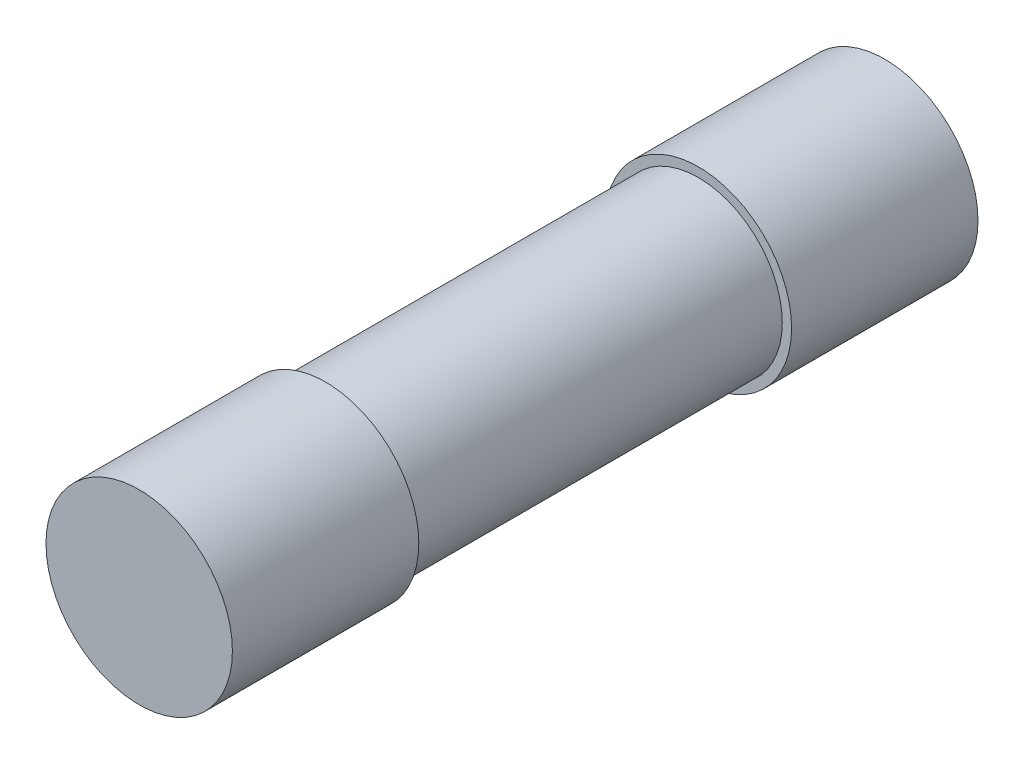
ISO-10303-21;
HEADER;
FILE_DESCRIPTION(('STEP AP214'),'2;1');
FILE_NAME('part.step','',(''),(''),'','','');
FILE_SCHEMA(('AUTOMOTIVE_DESIGN { 1 0 10303 214 1 1 1 1 }'));
ENDSEC;
DATA;
#1=APPLICATION_CONTEXT('core data for automotive mechanical design processes');
#2=APPLICATION_PROTOCOL_DEFINITION('international standard','automotive_design',2000,#1);
#3=PRODUCT_CONTEXT('',#1,'mechanical');
#4=PRODUCT('Part','Part','',(#3));
#5=PRODUCT_RELATED_PRODUCT_CATEGORY('part','',(#4));
#6=PRODUCT_DEFINITION_FORMATION('','',#4);
#7=PRODUCT_DEFINITION_CONTEXT('part definition',#1,'design');
#8=PRODUCT_DEFINITION('design','',#6,#7);
#9=PRODUCT_DEFINITION_SHAPE('','',#8);
#10=(LENGTH_UNIT() NAMED_UNIT(*) SI_UNIT(.MILLI.,.METRE.));
#11=(NAMED_UNIT(*) PLANE_ANGLE_UNIT() SI_UNIT($,.RADIAN.));
#12=(NAMED_UNIT(*) SI_UNIT($,.STERADIAN.) SOLID_ANGLE_UNIT());
#13=UNCERTAINTY_MEASURE_WITH_UNIT(LENGTH_MEASURE(1.E-05),#10,'distance_accuracy_value','');
#14=(GEOMETRIC_REPRESENTATION_CONTEXT(3) GLOBAL_UNCERTAINTY_ASSIGNED_CONTEXT((#13)) GLOBAL_UNIT_ASSIGNED_CONTEXT((#10,
#11,#12)) REPRESENTATION_CONTEXT('',''));
#15=CARTESIAN_POINT('',(0.,0.,0.));
#16=DIRECTION('',(0.,0.,1.));
#17=DIRECTION('',(1.,0.,0.));
#18=AXIS2_PLACEMENT_3D('',#15,#16,#17);
#19=CARTESIAN_POINT('',(0.,0.,-6.));
#20=DIRECTION('',(0.,0.,1.));
#21=DIRECTION('',(1.,0.,0.));
#22=AXIS2_PLACEMENT_3D('',#19,#20,#21);
#23=CYLINDRICAL_SURFACE('',#22,2.25);
#24=CARTESIAN_POINT('',(0.,0.,5.));
#25=DIRECTION('',(0.,0.,1.));
#26=DIRECTION('',(1.,0.,0.));
#27=AXIS2_PLACEMENT_3D('',#24,#25,#26);
#28=CIRCLE('',#27,2.25);
#29=CARTESIAN_POINT('',(2.25,0.,5.));
#30=VERTEX_POINT('',#29);
#31=EDGE_CURVE('E47',#30,#30,#28,.T.);
#32=ORIENTED_EDGE('',*,*,#31,.F.);
#33=EDGE_LOOP('',(#32));
#34=FACE_BOUND('',#33,.T.);
#35=CARTESIAN_POINT('',(0.,0.,-5.));
#36=DIRECTION('',(0.,0.,-1.));
#37=DIRECTION('',(-1.,0.,0.));
#38=AXIS2_PLACEMENT_3D('',#35,#36,#37);
#39=CIRCLE('',#38,2.25);
#40=CARTESIAN_POINT('',(-2.25,0.,-5.));
#41=VERTEX_POINT('',#40);
#42=EDGE_CURVE('E38',#41,#41,#39,.F.);
#43=ORIENTED_EDGE('',*,*,#42,.T.);
#44=EDGE_LOOP('',(#43));
#45=FACE_BOUND('',#44,.T.);
#46=ADVANCED_FACE('F34',(#34,#45),#23,.T.);
#47=CARTESIAN_POINT('',(0.,0.,5.));
#48=DIRECTION('',(0.,0.,1.));
#49=DIRECTION('',(1.,0.,0.));
#50=AXIS2_PLACEMENT_3D('',#47,#48,#49);
#51=CYLINDRICAL_SURFACE('',#50,2.5);
#52=CARTESIAN_POINT('',(0.,0.,5.));
#53=DIRECTION('',(0.,0.,1.));
#54=DIRECTION('',(1.,0.,0.));
#55=AXIS2_PLACEMENT_3D('',#52,#53,#54);
#56=CIRCLE('',#55,2.5);
#57=CARTESIAN_POINT('',(2.5,0.,5.));
#58=VERTEX_POINT('',#57);
#59=EDGE_CURVE('E10',#58,#58,#56,.T.);
#60=ORIENTED_EDGE('',*,*,#59,.T.);
#61=EDGE_LOOP('',(#60));
#62=FACE_BOUND('',#61,.T.);
#63=CARTESIAN_POINT('',(0.,0.,10.));
#64=DIRECTION('',(0.,0.,1.));
#65=DIRECTION('',(1.,0.,0.));
#66=AXIS2_PLACEMENT_3D('',#63,#64,#65);
#67=CIRCLE('',#66,2.5);
#68=CARTESIAN_POINT('',(2.5,0.,10.));
#69=VERTEX_POINT('',#68);
#70=EDGE_CURVE('E42',#69,#69,#67,.T.);
#71=ORIENTED_EDGE('',*,*,#70,.F.);
#72=EDGE_LOOP('',(#71));
#73=FACE_BOUND('',#72,.T.);
#74=ADVANCED_FACE('F36',(#62,#73),#51,.T.);
#75=CARTESIAN_POINT('',(0.,0.,5.));
#76=DIRECTION('',(0.,0.,1.));
#77=DIRECTION('',(1.,0.,0.));
#78=AXIS2_PLACEMENT_3D('',#75,#76,#77);
#79=PLANE('',#78);
#80=ORIENTED_EDGE('',*,*,#31,.T.);
#81=EDGE_LOOP('',(#80));
#82=FACE_BOUND('',#81,.T.);
#83=ORIENTED_EDGE('',*,*,#59,.F.);
#84=EDGE_LOOP('',(#83));
#85=FACE_BOUND('',#84,.T.);
#86=ADVANCED_FACE('F83',(#82,#85),#79,.F.);
#87=CARTESIAN_POINT('',(0.,0.,10.));
#88=DIRECTION('',(0.,0.,1.));
#89=DIRECTION('',(1.,0.,0.));
#90=AXIS2_PLACEMENT_3D('',#87,#88,#89);
#91=PLANE('',#90);
#92=ORIENTED_EDGE('',*,*,#70,.T.);
#93=EDGE_LOOP('',(#92));
#94=FACE_BOUND('',#93,.T.);
#95=ADVANCED_FACE('F86',(#94),#91,.T.);
#96=CARTESIAN_POINT('',(0.,0.,-5.));
#97=DIRECTION('',(0.,0.,-1.));
#98=DIRECTION('',(-1.,0.,0.));
#99=AXIS2_PLACEMENT_3D('',#96,#97,#98);
#100=CYLINDRICAL_SURFACE('',#99,2.5);
#101=CARTESIAN_POINT('',(0.,0.,-5.));
#102=DIRECTION('',(0.,0.,1.));
#103=DIRECTION('',(1.,0.,0.));
#104=AXIS2_PLACEMENT_3D('',#101,#102,#103);
#105=CIRCLE('',#104,2.5);
#106=CARTESIAN_POINT('',(2.5,0.,-5.));
#107=VERTEX_POINT('',#106);
#108=EDGE_CURVE('E56',#107,#107,#105,.T.);
#109=ORIENTED_EDGE('',*,*,#108,.F.);
#110=EDGE_LOOP('',(#109));
#111=FACE_BOUND('',#110,.T.);
#112=CARTESIAN_POINT('',(0.,0.,-10.));
#113=DIRECTION('',(0.,0.,1.));
#114=DIRECTION('',(1.,0.,0.));
#115=AXIS2_PLACEMENT_3D('',#112,#113,#114);
#116=CIRCLE('',#115,2.5);
#117=CARTESIAN_POINT('',(2.5,0.,-10.));
#118=VERTEX_POINT('',#117);
#119=EDGE_CURVE('E50',#118,#118,#116,.T.);
#120=ORIENTED_EDGE('',*,*,#119,.T.);
#121=EDGE_LOOP('',(#120));
#122=FACE_BOUND('',#121,.T.);
#123=ADVANCED_FACE('F65',(#111,#122),#100,.T.);
#124=CARTESIAN_POINT('',(0.,0.,-5.));
#125=DIRECTION('',(0.,0.,-1.));
#126=DIRECTION('',(1.,0.,0.));
#127=AXIS2_PLACEMENT_3D('',#124,#125,#126);
#128=PLANE('',#127);
#129=ORIENTED_EDGE('',*,*,#42,.F.);
#130=EDGE_LOOP('',(#129));
#131=FACE_BOUND('',#130,.T.);
#132=ORIENTED_EDGE('',*,*,#108,.T.);
#133=EDGE_LOOP('',(#132));
#134=FACE_BOUND('',#133,.T.);
#135=ADVANCED_FACE('F69',(#131,#134),#128,.F.);
#136=CARTESIAN_POINT('',(0.,0.,-10.));
#137=DIRECTION('',(0.,0.,-1.));
#138=DIRECTION('',(1.,0.,0.));
#139=AXIS2_PLACEMENT_3D('',#136,#137,#138);
#140=PLANE('',#139);
#141=ORIENTED_EDGE('',*,*,#119,.F.);
#142=EDGE_LOOP('',(#141));
#143=FACE_BOUND('',#142,.T.);
#144=ADVANCED_FACE('F67',(#143),#140,.T.);
#145=CLOSED_SHELL('',(#46,#74,#86,#95,#123,#135,#144));
#146=MANIFOLD_SOLID_BREP('B2',#145);
#147=ADVANCED_BREP_SHAPE_REPRESENTATION('',(#18,#146),#14);
#148=SHAPE_DEFINITION_REPRESENTATION(#9,#147);
ENDSEC;
END-ISO-10303-21;
